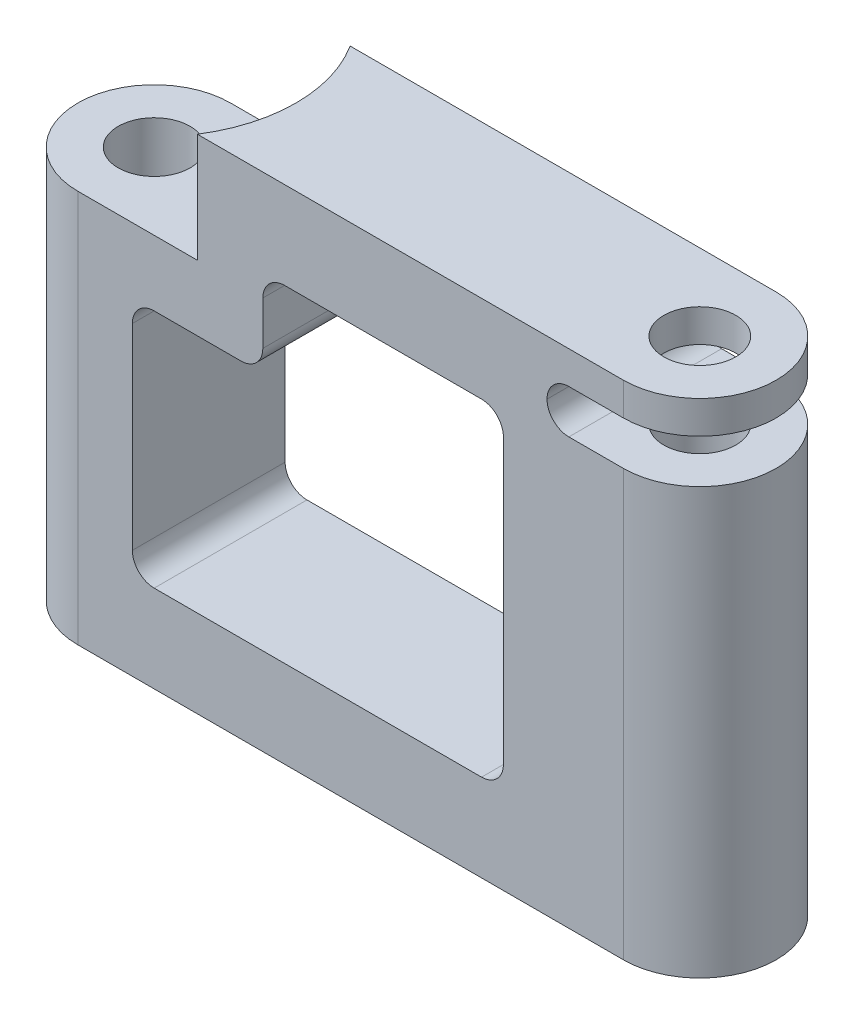
ISO-10303-21;
HEADER;
FILE_DESCRIPTION(('STEP AP214'),'2;1');
FILE_NAME('part.step','',(''),(''),'','','');
FILE_SCHEMA(('AUTOMOTIVE_DESIGN { 1 0 10303 214 1 1 1 1 }'));
ENDSEC;
DATA;
#1=APPLICATION_CONTEXT('core data for automotive mechanical design processes');
#2=APPLICATION_PROTOCOL_DEFINITION('international standard','automotive_design',2000,#1);
#3=PRODUCT_CONTEXT('',#1,'mechanical');
#4=PRODUCT('Part','Part','',(#3));
#5=PRODUCT_RELATED_PRODUCT_CATEGORY('part','',(#4));
#6=PRODUCT_DEFINITION_FORMATION('','',#4);
#7=PRODUCT_DEFINITION_CONTEXT('part definition',#1,'design');
#8=PRODUCT_DEFINITION('design','',#6,#7);
#9=PRODUCT_DEFINITION_SHAPE('','',#8);
#10=(LENGTH_UNIT() NAMED_UNIT(*) SI_UNIT(.MILLI.,.METRE.));
#11=(NAMED_UNIT(*) PLANE_ANGLE_UNIT() SI_UNIT($,.RADIAN.));
#12=(NAMED_UNIT(*) SI_UNIT($,.STERADIAN.) SOLID_ANGLE_UNIT());
#13=UNCERTAINTY_MEASURE_WITH_UNIT(LENGTH_MEASURE(1.E-05),#10,'distance_accuracy_value','');
#14=(GEOMETRIC_REPRESENTATION_CONTEXT(3) GLOBAL_UNCERTAINTY_ASSIGNED_CONTEXT((#13)) GLOBAL_UNIT_ASSIGNED_CONTEXT((#10,
#11,#12)) REPRESENTATION_CONTEXT('',''));
#15=CARTESIAN_POINT('',(0.,0.,0.));
#16=DIRECTION('',(0.,0.,1.));
#17=DIRECTION('',(1.,0.,0.));
#18=AXIS2_PLACEMENT_3D('',#15,#16,#17);
#19=CARTESIAN_POINT('',(12.5,11.5,0.));
#20=DIRECTION('',(0.,-1.,0.));
#21=DIRECTION('',(0.,0.,-1.));
#22=AXIS2_PLACEMENT_3D('',#19,#20,#21);
#23=CYLINDRICAL_SURFACE('',#22,3.5);
#24=CARTESIAN_POINT('',(12.5,10.,0.));
#25=DIRECTION('',(0.,1.,0.));
#26=DIRECTION('',(0.,0.,1.));
#27=AXIS2_PLACEMENT_3D('',#24,#25,#26);
#28=CIRCLE('',#27,3.5);
#29=CARTESIAN_POINT('',(12.5,10.,3.5));
#30=VERTEX_POINT('',#29);
#31=CARTESIAN_POINT('',(12.5,10.,-3.50000000000001));
#32=VERTEX_POINT('',#31);
#33=EDGE_CURVE('E364',#30,#32,#28,.T.);
#34=ORIENTED_EDGE('',*,*,#33,.T.);
#35=DIRECTION('',(0.,-1.,0.));
#36=VECTOR('',#35,1.);
#37=CARTESIAN_POINT('',(12.5,11.5,-3.50000000000001));
#38=LINE('',#37,#36);
#39=CARTESIAN_POINT('',(12.5,11.5,-3.50000000000001));
#40=VERTEX_POINT('',#39);
#41=EDGE_CURVE('E216',#40,#32,#38,.T.);
#42=ORIENTED_EDGE('',*,*,#41,.F.);
#43=CARTESIAN_POINT('',(12.5,11.5,0.));
#44=DIRECTION('',(0.,1.,0.));
#45=DIRECTION('',(0.,0.,1.));
#46=AXIS2_PLACEMENT_3D('',#43,#44,#45);
#47=CIRCLE('',#46,3.5);
#48=CARTESIAN_POINT('',(12.5,11.5,3.5));
#49=VERTEX_POINT('',#48);
#50=EDGE_CURVE('E385',#49,#40,#47,.T.);
#51=ORIENTED_EDGE('',*,*,#50,.F.);
#52=DIRECTION('',(0.,-1.,0.));
#53=VECTOR('',#52,1.);
#54=CARTESIAN_POINT('',(12.5,11.5,3.5));
#55=LINE('',#54,#53);
#56=EDGE_CURVE('E215',#49,#30,#55,.T.);
#57=ORIENTED_EDGE('',*,*,#56,.T.);
#58=EDGE_LOOP('',(#34,#42,#51,#57));
#59=FACE_BOUND('',#58,.T.);
#60=ADVANCED_FACE('F35',(#59),#23,.T.);
#61=CARTESIAN_POINT('',(12.5,-35.,0.));
#62=DIRECTION('',(0.,1.,0.));
#63=DIRECTION('',(0.,0.,1.));
#64=AXIS2_PLACEMENT_3D('',#61,#62,#63);
#65=CYLINDRICAL_SURFACE('',#64,1.65);
#66=CARTESIAN_POINT('',(12.5,9.99999999999999,0.));
#67=DIRECTION('',(0.,1.,0.));
#68=DIRECTION('',(0.,0.,1.));
#69=AXIS2_PLACEMENT_3D('',#66,#67,#68);
#70=CIRCLE('',#69,1.65);
#71=CARTESIAN_POINT('',(12.5,9.99999999999999,1.65));
#72=VERTEX_POINT('',#71);
#73=EDGE_CURVE('E201',#72,#72,#70,.F.);
#74=ORIENTED_EDGE('',*,*,#73,.T.);
#75=EDGE_LOOP('',(#74));
#76=FACE_BOUND('',#75,.T.);
#77=CARTESIAN_POINT('',(12.5,11.5,0.));
#78=DIRECTION('',(0.,1.,0.));
#79=DIRECTION('',(0.,0.,1.));
#80=AXIS2_PLACEMENT_3D('',#77,#78,#79);
#81=CIRCLE('',#80,1.65);
#82=CARTESIAN_POINT('',(12.5,11.5,1.65));
#83=VERTEX_POINT('',#82);
#84=EDGE_CURVE('E233',#83,#83,#81,.T.);
#85=ORIENTED_EDGE('',*,*,#84,.T.);
#86=EDGE_LOOP('',(#85));
#87=FACE_BOUND('',#86,.T.);
#88=ADVANCED_FACE('F452',(#76,#87),#65,.F.);
#89=CARTESIAN_POINT('',(-12.5,11.5,0.));
#90=DIRECTION('',(0.,-1.,0.));
#91=DIRECTION('',(0.,0.,-1.));
#92=AXIS2_PLACEMENT_3D('',#89,#90,#91);
#93=CYLINDRICAL_SURFACE('',#92,3.5);
#94=CARTESIAN_POINT('',(-12.5,6.5,0.));
#95=DIRECTION('',(0.,1.,0.));
#96=DIRECTION('',(0.,0.,1.));
#97=AXIS2_PLACEMENT_3D('',#94,#95,#96);
#98=CIRCLE('',#97,3.5);
#99=CARTESIAN_POINT('',(-12.5,6.5,-3.5));
#100=VERTEX_POINT('',#99);
#101=CARTESIAN_POINT('',(-12.5,6.5,3.5));
#102=VERTEX_POINT('',#101);
#103=EDGE_CURVE('E371',#100,#102,#98,.T.);
#104=ORIENTED_EDGE('',*,*,#103,.F.);
#105=DIRECTION('',(0.,-1.,0.));
#106=VECTOR('',#105,1.);
#107=CARTESIAN_POINT('',(-12.5,11.5,-3.5));
#108=LINE('',#107,#106);
#109=CARTESIAN_POINT('',(-12.5,-11.5,-3.5));
#110=VERTEX_POINT('',#109);
#111=EDGE_CURVE('E391',#100,#110,#108,.T.);
#112=ORIENTED_EDGE('',*,*,#111,.T.);
#113=CARTESIAN_POINT('',(-12.5,-11.5,0.));
#114=DIRECTION('',(0.,1.,0.));
#115=DIRECTION('',(0.,0.,1.));
#116=AXIS2_PLACEMENT_3D('',#113,#114,#115);
#117=CIRCLE('',#116,3.5);
#118=CARTESIAN_POINT('',(-12.5,-11.5,3.5));
#119=VERTEX_POINT('',#118);
#120=EDGE_CURVE('E382',#110,#119,#117,.T.);
#121=ORIENTED_EDGE('',*,*,#120,.T.);
#122=DIRECTION('',(0.,-1.,0.));
#123=VECTOR('',#122,1.);
#124=CARTESIAN_POINT('',(-12.5,11.5,3.5));
#125=LINE('',#124,#123);
#126=EDGE_CURVE('E219',#102,#119,#125,.T.);
#127=ORIENTED_EDGE('',*,*,#126,.F.);
#128=EDGE_LOOP('',(#104,#112,#121,#127));
#129=FACE_BOUND('',#128,.T.);
#130=ADVANCED_FACE('F406',(#129),#93,.T.);
#131=CARTESIAN_POINT('',(-12.5,-35.,0.));
#132=DIRECTION('',(0.,1.,0.));
#133=DIRECTION('',(0.,0.,1.));
#134=AXIS2_PLACEMENT_3D('',#131,#132,#133);
#135=CYLINDRICAL_SURFACE('',#134,1.65);
#136=CARTESIAN_POINT('',(-12.5,-11.5,0.));
#137=DIRECTION('',(0.,1.,0.));
#138=DIRECTION('',(0.,0.,1.));
#139=AXIS2_PLACEMENT_3D('',#136,#137,#138);
#140=CIRCLE('',#139,1.65);
#141=CARTESIAN_POINT('',(-12.5,-11.5,1.65));
#142=VERTEX_POINT('',#141);
#143=EDGE_CURVE('E226',#142,#142,#140,.T.);
#144=ORIENTED_EDGE('',*,*,#143,.F.);
#145=EDGE_LOOP('',(#144));
#146=FACE_BOUND('',#145,.T.);
#147=CARTESIAN_POINT('',(-12.5,6.5,0.));
#148=DIRECTION('',(0.,1.,0.));
#149=DIRECTION('',(0.,0.,1.));
#150=AXIS2_PLACEMENT_3D('',#147,#148,#149);
#151=CIRCLE('',#150,1.65);
#152=CARTESIAN_POINT('',(-12.5,6.5,1.65));
#153=VERTEX_POINT('',#152);
#154=EDGE_CURVE('E234',#153,#153,#151,.F.);
#155=ORIENTED_EDGE('',*,*,#154,.F.);
#156=EDGE_LOOP('',(#155));
#157=FACE_BOUND('',#156,.T.);
#158=ADVANCED_FACE('F467',(#146,#157),#135,.F.);
#159=CARTESIAN_POINT('',(-12.5,11.5,3.5));
#160=DIRECTION('',(0.,0.,-1.));
#161=DIRECTION('',(-1.,0.,0.));
#162=AXIS2_PLACEMENT_3D('',#159,#160,#161);
#163=PLANE('',#162);
#164=DIRECTION('',(1.,0.,0.));
#165=VECTOR('',#164,1.);
#166=CARTESIAN_POINT('',(-12.5,3.5,3.5));
#167=LINE('',#166,#165);
#168=CARTESIAN_POINT('',(-9.,3.5,3.5));
#169=VERTEX_POINT('',#168);
#170=CARTESIAN_POINT('',(-5.02277442494834,3.5,3.5));
#171=VERTEX_POINT('',#170);
#172=EDGE_CURVE('E261',#169,#171,#167,.T.);
#173=ORIENTED_EDGE('',*,*,#172,.T.);
#174=CARTESIAN_POINT('',(-5.02277442494834,4.5,3.5));
#175=DIRECTION('',(0.,0.,-1.));
#176=DIRECTION('',(-1.,0.,0.));
#177=AXIS2_PLACEMENT_3D('',#174,#175,#176);
#178=CIRCLE('',#177,1.);
#179=CARTESIAN_POINT('',(-4.02277442494834,4.5,3.5));
#180=VERTEX_POINT('',#179);
#181=EDGE_CURVE('E50',#171,#180,#178,.F.);
#182=ORIENTED_EDGE('',*,*,#181,.T.);
#183=DIRECTION('',(0.,1.,0.));
#184=VECTOR('',#183,1.);
#185=CARTESIAN_POINT('',(-4.02277442494834,11.5,3.5));
#186=LINE('',#185,#184);
#187=CARTESIAN_POINT('',(-4.02277442494834,6.5,3.5));
#188=VERTEX_POINT('',#187);
#189=EDGE_CURVE('E357',#180,#188,#186,.T.);
#190=ORIENTED_EDGE('',*,*,#189,.T.);
#191=CARTESIAN_POINT('',(-3.02277442494834,6.5,3.5));
#192=DIRECTION('',(0.,0.,-1.));
#193=DIRECTION('',(-1.,0.,0.));
#194=AXIS2_PLACEMENT_3D('',#191,#192,#193);
#195=CIRCLE('',#194,1.);
#196=CARTESIAN_POINT('',(-3.02277442494834,7.5,3.5));
#197=VERTEX_POINT('',#196);
#198=EDGE_CURVE('E311',#188,#197,#195,.T.);
#199=ORIENTED_EDGE('',*,*,#198,.T.);
#200=DIRECTION('',(1.,0.,0.));
#201=VECTOR('',#200,1.);
#202=CARTESIAN_POINT('',(-12.5,7.5,3.5));
#203=LINE('',#202,#201);
#204=CARTESIAN_POINT('',(6.00000000000001,7.5,3.5));
#205=VERTEX_POINT('',#204);
#206=EDGE_CURVE('E354',#197,#205,#203,.T.);
#207=ORIENTED_EDGE('',*,*,#206,.T.);
#208=CARTESIAN_POINT('',(6.00000000000001,6.5,3.5));
#209=DIRECTION('',(0.,0.,-1.));
#210=DIRECTION('',(-1.,0.,0.));
#211=AXIS2_PLACEMENT_3D('',#208,#209,#210);
#212=CIRCLE('',#211,1.);
#213=CARTESIAN_POINT('',(7.,6.5,3.5));
#214=VERTEX_POINT('',#213);
#215=EDGE_CURVE('E315',#205,#214,#212,.T.);
#216=ORIENTED_EDGE('',*,*,#215,.T.);
#217=DIRECTION('',(0.,-1.,0.));
#218=VECTOR('',#217,1.);
#219=CARTESIAN_POINT('',(7.,11.5,3.5));
#220=LINE('',#219,#218);
#221=CARTESIAN_POINT('',(7.,-6.5,3.5));
#222=VERTEX_POINT('',#221);
#223=EDGE_CURVE('E349',#214,#222,#220,.T.);
#224=ORIENTED_EDGE('',*,*,#223,.T.);
#225=CARTESIAN_POINT('',(6.00000000000001,-6.5,3.5));
#226=DIRECTION('',(0.,0.,-1.));
#227=DIRECTION('',(-1.,0.,0.));
#228=AXIS2_PLACEMENT_3D('',#225,#226,#227);
#229=CIRCLE('',#228,1.);
#230=CARTESIAN_POINT('',(6.00000000000001,-7.5,3.5));
#231=VERTEX_POINT('',#230);
#232=EDGE_CURVE('E319',#222,#231,#229,.T.);
#233=ORIENTED_EDGE('',*,*,#232,.T.);
#234=DIRECTION('',(-1.,0.,0.));
#235=VECTOR('',#234,1.);
#236=CARTESIAN_POINT('',(-12.5,-7.5,3.5));
#237=LINE('',#236,#235);
#238=CARTESIAN_POINT('',(-9.,-7.5,3.5));
#239=VERTEX_POINT('',#238);
#240=EDGE_CURVE('E344',#231,#239,#237,.T.);
#241=ORIENTED_EDGE('',*,*,#240,.T.);
#242=CARTESIAN_POINT('',(-9.,-6.5,3.5));
#243=DIRECTION('',(0.,0.,-1.));
#244=DIRECTION('',(-1.,0.,0.));
#245=AXIS2_PLACEMENT_3D('',#242,#243,#244);
#246=CIRCLE('',#245,1.);
#247=CARTESIAN_POINT('',(-10.,-6.5,3.5));
#248=VERTEX_POINT('',#247);
#249=EDGE_CURVE('E323',#239,#248,#246,.T.);
#250=ORIENTED_EDGE('',*,*,#249,.T.);
#251=DIRECTION('',(0.,1.,0.));
#252=VECTOR('',#251,1.);
#253=CARTESIAN_POINT('',(-10.,11.5,3.5));
#254=LINE('',#253,#252);
#255=CARTESIAN_POINT('',(-10.,2.5,3.5));
#256=VERTEX_POINT('',#255);
#257=EDGE_CURVE('E343',#248,#256,#254,.T.);
#258=ORIENTED_EDGE('',*,*,#257,.T.);
#259=CARTESIAN_POINT('',(-9.,2.5,3.5));
#260=DIRECTION('',(0.,0.,-1.));
#261=DIRECTION('',(-1.,0.,0.));
#262=AXIS2_PLACEMENT_3D('',#259,#260,#261);
#263=CIRCLE('',#262,1.);
#264=EDGE_CURVE('E43',#256,#169,#263,.T.);
#265=ORIENTED_EDGE('',*,*,#264,.T.);
#266=EDGE_LOOP('',(#173,#182,#190,#199,#207,#216,#224,#233,#241,#250,#258,#265));
#267=FACE_BOUND('',#266,.T.);
#268=CARTESIAN_POINT('',(10.,9.,3.5));
#269=DIRECTION('',(0.,0.,-1.));
#270=DIRECTION('',(-1.,0.,0.));
#271=AXIS2_PLACEMENT_3D('',#268,#269,#270);
#272=CIRCLE('',#271,1.);
#273=CARTESIAN_POINT('',(10.,8.,3.5));
#274=VERTEX_POINT('',#273);
#275=CARTESIAN_POINT('',(9.00000000000001,9.,3.5));
#276=VERTEX_POINT('',#275);
#277=EDGE_CURVE('E250',#274,#276,#272,.T.);
#278=ORIENTED_EDGE('',*,*,#277,.T.);
#279=CARTESIAN_POINT('',(10.,9.,3.5));
#280=DIRECTION('',(0.,0.,-1.));
#281=DIRECTION('',(-1.,0.,0.));
#282=AXIS2_PLACEMENT_3D('',#279,#280,#281);
#283=CIRCLE('',#282,1.);
#284=CARTESIAN_POINT('',(10.,10.,3.5));
#285=VERTEX_POINT('',#284);
#286=EDGE_CURVE('E254',#276,#285,#283,.T.);
#287=ORIENTED_EDGE('',*,*,#286,.T.);
#288=DIRECTION('',(1.,0.,0.));
#289=VECTOR('',#288,1.);
#290=CARTESIAN_POINT('',(-12.5,10.,3.5));
#291=LINE('',#290,#289);
#292=EDGE_CURVE('E366',#285,#30,#291,.T.);
#293=ORIENTED_EDGE('',*,*,#292,.T.);
#294=ORIENTED_EDGE('',*,*,#56,.F.);
#295=DIRECTION('',(1.,0.,0.));
#296=VECTOR('',#295,1.);
#297=CARTESIAN_POINT('',(-12.5,11.5,3.5));
#298=LINE('',#297,#296);
#299=CARTESIAN_POINT('',(-7.02277442494834,11.5,3.5));
#300=VERTEX_POINT('',#299);
#301=EDGE_CURVE('E383',#300,#49,#298,.T.);
#302=ORIENTED_EDGE('',*,*,#301,.F.);
#303=DIRECTION('',(0.,1.,0.));
#304=VECTOR('',#303,1.);
#305=CARTESIAN_POINT('',(-7.02277442494834,6.5,3.5));
#306=LINE('',#305,#304);
#307=CARTESIAN_POINT('',(-7.02277442494834,6.5,3.5));
#308=VERTEX_POINT('',#307);
#309=EDGE_CURVE('E230',#300,#308,#306,.F.);
#310=ORIENTED_EDGE('',*,*,#309,.T.);
#311=DIRECTION('',(1.,0.,0.));
#312=VECTOR('',#311,1.);
#313=CARTESIAN_POINT('',(-12.5,6.5,3.5));
#314=LINE('',#313,#312);
#315=EDGE_CURVE('E373',#102,#308,#314,.T.);
#316=ORIENTED_EDGE('',*,*,#315,.F.);
#317=ORIENTED_EDGE('',*,*,#126,.T.);
#318=DIRECTION('',(1.,0.,0.));
#319=VECTOR('',#318,1.);
#320=CARTESIAN_POINT('',(-12.5,-11.5,3.5));
#321=LINE('',#320,#319);
#322=CARTESIAN_POINT('',(12.5,-11.5,3.5));
#323=VERTEX_POINT('',#322);
#324=EDGE_CURVE('E213',#119,#323,#321,.T.);
#325=ORIENTED_EDGE('',*,*,#324,.T.);
#326=CARTESIAN_POINT('',(12.5,8.,3.5));
#327=VERTEX_POINT('',#326);
#328=EDGE_CURVE('E206',#327,#323,#55,.T.);
#329=ORIENTED_EDGE('',*,*,#328,.F.);
#330=DIRECTION('',(-1.,0.,0.));
#331=VECTOR('',#330,1.);
#332=CARTESIAN_POINT('',(-12.5,8.,3.5));
#333=LINE('',#332,#331);
#334=EDGE_CURVE('E191',#327,#274,#333,.T.);
#335=ORIENTED_EDGE('',*,*,#334,.T.);
#336=EDGE_LOOP('',(#278,#287,#293,#294,#302,#310,#316,#317,#325,#329,#335));
#337=FACE_BOUND('',#336,.T.);
#338=ADVANCED_FACE('F211',(#267,#337),#163,.F.);
#339=CARTESIAN_POINT('',(12.5,8.,-3.50000000000001));
#340=VERTEX_POINT('',#339);
#341=CARTESIAN_POINT('',(12.5,-11.5,-3.50000000000001));
#342=VERTEX_POINT('',#341);
#343=EDGE_CURVE('E208',#340,#342,#38,.T.);
#344=ORIENTED_EDGE('',*,*,#343,.F.);
#345=CARTESIAN_POINT('',(12.5,8.,0.));
#346=DIRECTION('',(0.,-1.,0.));
#347=DIRECTION('',(0.,0.,-1.));
#348=AXIS2_PLACEMENT_3D('',#345,#346,#347);
#349=CIRCLE('',#348,3.5);
#350=EDGE_CURVE('E195',#340,#327,#349,.T.);
#351=ORIENTED_EDGE('',*,*,#350,.T.);
#352=ORIENTED_EDGE('',*,*,#328,.T.);
#353=CARTESIAN_POINT('',(12.5,-11.5,0.));
#354=DIRECTION('',(0.,1.,0.));
#355=DIRECTION('',(0.,0.,1.));
#356=AXIS2_PLACEMENT_3D('',#353,#354,#355);
#357=CIRCLE('',#356,3.5);
#358=EDGE_CURVE('E395',#323,#342,#357,.T.);
#359=ORIENTED_EDGE('',*,*,#358,.T.);
#360=EDGE_LOOP('',(#344,#351,#352,#359));
#361=FACE_BOUND('',#360,.T.);
#362=ADVANCED_FACE('F204',(#361),#23,.T.);
#363=CARTESIAN_POINT('',(-12.5,11.5,-3.5));
#364=DIRECTION('',(0.,0.,1.));
#365=DIRECTION('',(1.,0.,0.));
#366=AXIS2_PLACEMENT_3D('',#363,#364,#365);
#367=PLANE('',#366);
#368=DIRECTION('',(0.,-1.,0.));
#369=VECTOR('',#368,1.);
#370=CARTESIAN_POINT('',(-4.02277442494834,11.5,-3.50000000000001));
#371=LINE('',#370,#369);
#372=CARTESIAN_POINT('',(-4.02277442494834,6.5,-3.50000000000001));
#373=VERTEX_POINT('',#372);
#374=CARTESIAN_POINT('',(-4.02277442494834,4.5,-3.50000000000001));
#375=VERTEX_POINT('',#374);
#376=EDGE_CURVE('E273',#373,#375,#371,.T.);
#377=ORIENTED_EDGE('',*,*,#376,.T.);
#378=CARTESIAN_POINT('',(-5.02277442494834,4.5,-3.5));
#379=DIRECTION('',(0.,0.,1.));
#380=DIRECTION('',(1.,0.,0.));
#381=AXIS2_PLACEMENT_3D('',#378,#379,#380);
#382=CIRCLE('',#381,1.);
#383=CARTESIAN_POINT('',(-5.02277442494834,3.5,-3.50000000000001));
#384=VERTEX_POINT('',#383);
#385=EDGE_CURVE('E309',#375,#384,#382,.F.);
#386=ORIENTED_EDGE('',*,*,#385,.T.);
#387=DIRECTION('',(-1.,0.,0.));
#388=VECTOR('',#387,1.);
#389=CARTESIAN_POINT('',(-12.5,3.5,-3.5));
#390=LINE('',#389,#388);
#391=CARTESIAN_POINT('',(-9.,3.5,-3.5));
#392=VERTEX_POINT('',#391);
#393=EDGE_CURVE('E276',#384,#392,#390,.T.);
#394=ORIENTED_EDGE('',*,*,#393,.T.);
#395=CARTESIAN_POINT('',(-9.,2.5,-3.5));
#396=DIRECTION('',(0.,0.,1.));
#397=DIRECTION('',(1.,0.,0.));
#398=AXIS2_PLACEMENT_3D('',#395,#396,#397);
#399=CIRCLE('',#398,1.);
#400=CARTESIAN_POINT('',(-10.,2.5,-3.5));
#401=VERTEX_POINT('',#400);
#402=EDGE_CURVE('E11',#392,#401,#399,.T.);
#403=ORIENTED_EDGE('',*,*,#402,.T.);
#404=DIRECTION('',(0.,-1.,0.));
#405=VECTOR('',#404,1.);
#406=CARTESIAN_POINT('',(-10.,11.5,-3.5));
#407=LINE('',#406,#405);
#408=CARTESIAN_POINT('',(-10.,-6.5,-3.5));
#409=VERTEX_POINT('',#408);
#410=EDGE_CURVE('E258',#401,#409,#407,.T.);
#411=ORIENTED_EDGE('',*,*,#410,.T.);
#412=CARTESIAN_POINT('',(-9.,-6.5,-3.5));
#413=DIRECTION('',(0.,0.,1.));
#414=DIRECTION('',(1.,0.,0.));
#415=AXIS2_PLACEMENT_3D('',#412,#413,#414);
#416=CIRCLE('',#415,1.);
#417=CARTESIAN_POINT('',(-9.,-7.5,-3.5));
#418=VERTEX_POINT('',#417);
#419=EDGE_CURVE('E325',#409,#418,#416,.T.);
#420=ORIENTED_EDGE('',*,*,#419,.T.);
#421=DIRECTION('',(1.,0.,0.));
#422=VECTOR('',#421,1.);
#423=CARTESIAN_POINT('',(-12.5,-7.5,-3.5));
#424=LINE('',#423,#422);
#425=CARTESIAN_POINT('',(6.00000000000001,-7.5,-3.50000000000001));
#426=VERTEX_POINT('',#425);
#427=EDGE_CURVE('E264',#418,#426,#424,.T.);
#428=ORIENTED_EDGE('',*,*,#427,.T.);
#429=CARTESIAN_POINT('',(6.00000000000001,-6.5,-3.50000000000001));
#430=DIRECTION('',(0.,0.,1.));
#431=DIRECTION('',(1.,0.,0.));
#432=AXIS2_PLACEMENT_3D('',#429,#430,#431);
#433=CIRCLE('',#432,1.);
#434=CARTESIAN_POINT('',(7.,-6.5,-3.50000000000001));
#435=VERTEX_POINT('',#434);
#436=EDGE_CURVE('E321',#426,#435,#433,.T.);
#437=ORIENTED_EDGE('',*,*,#436,.T.);
#438=DIRECTION('',(0.,1.,0.));
#439=VECTOR('',#438,1.);
#440=CARTESIAN_POINT('',(7.,11.5,-3.50000000000001));
#441=LINE('',#440,#439);
#442=CARTESIAN_POINT('',(7.,6.5,-3.50000000000001));
#443=VERTEX_POINT('',#442);
#444=EDGE_CURVE('E267',#435,#443,#441,.T.);
#445=ORIENTED_EDGE('',*,*,#444,.T.);
#446=CARTESIAN_POINT('',(6.00000000000001,6.5,-3.50000000000001));
#447=DIRECTION('',(0.,0.,1.));
#448=DIRECTION('',(1.,0.,0.));
#449=AXIS2_PLACEMENT_3D('',#446,#447,#448);
#450=CIRCLE('',#449,1.);
#451=CARTESIAN_POINT('',(6.00000000000001,7.5,-3.50000000000001));
#452=VERTEX_POINT('',#451);
#453=EDGE_CURVE('E317',#443,#452,#450,.T.);
#454=ORIENTED_EDGE('',*,*,#453,.T.);
#455=DIRECTION('',(-1.,0.,0.));
#456=VECTOR('',#455,1.);
#457=CARTESIAN_POINT('',(-12.5,7.5,-3.5));
#458=LINE('',#457,#456);
#459=CARTESIAN_POINT('',(-3.02277442494834,7.5,-3.50000000000001));
#460=VERTEX_POINT('',#459);
#461=EDGE_CURVE('E270',#452,#460,#458,.T.);
#462=ORIENTED_EDGE('',*,*,#461,.T.);
#463=CARTESIAN_POINT('',(-3.02277442494834,6.5,-3.50000000000001));
#464=DIRECTION('',(0.,0.,1.));
#465=DIRECTION('',(1.,0.,0.));
#466=AXIS2_PLACEMENT_3D('',#463,#464,#465);
#467=CIRCLE('',#466,1.);
#468=EDGE_CURVE('E313',#460,#373,#467,.T.);
#469=ORIENTED_EDGE('',*,*,#468,.T.);
#470=EDGE_LOOP('',(#377,#386,#394,#403,#411,#420,#428,#437,#445,#454,#462,#469));
#471=FACE_BOUND('',#470,.T.);
#472=ORIENTED_EDGE('',*,*,#41,.T.);
#473=DIRECTION('',(-1.,0.,0.));
#474=VECTOR('',#473,1.);
#475=CARTESIAN_POINT('',(-12.5,10.,-3.5));
#476=LINE('',#475,#474);
#477=CARTESIAN_POINT('',(10.,10.,-3.50000000000001));
#478=VERTEX_POINT('',#477);
#479=EDGE_CURVE('E246',#32,#478,#476,.T.);
#480=ORIENTED_EDGE('',*,*,#479,.T.);
#481=CARTESIAN_POINT('',(10.,9.,-3.50000000000001));
#482=DIRECTION('',(0.,0.,1.));
#483=DIRECTION('',(1.,0.,0.));
#484=AXIS2_PLACEMENT_3D('',#481,#482,#483);
#485=CIRCLE('',#484,1.);
#486=CARTESIAN_POINT('',(9.00000000000001,9.,-3.50000000000001));
#487=VERTEX_POINT('',#486);
#488=EDGE_CURVE('E256',#478,#487,#485,.T.);
#489=ORIENTED_EDGE('',*,*,#488,.T.);
#490=CARTESIAN_POINT('',(10.,9.,-3.50000000000001));
#491=DIRECTION('',(0.,0.,1.));
#492=DIRECTION('',(1.,0.,0.));
#493=AXIS2_PLACEMENT_3D('',#490,#491,#492);
#494=CIRCLE('',#493,1.);
#495=CARTESIAN_POINT('',(10.,8.,-3.50000000000001));
#496=VERTEX_POINT('',#495);
#497=EDGE_CURVE('E252',#487,#496,#494,.T.);
#498=ORIENTED_EDGE('',*,*,#497,.T.);
#499=DIRECTION('',(1.,0.,0.));
#500=VECTOR('',#499,1.);
#501=CARTESIAN_POINT('',(-12.5,8.,-3.5));
#502=LINE('',#501,#500);
#503=EDGE_CURVE('E209',#496,#340,#502,.T.);
#504=ORIENTED_EDGE('',*,*,#503,.T.);
#505=ORIENTED_EDGE('',*,*,#343,.T.);
#506=DIRECTION('',(-1.,0.,0.));
#507=VECTOR('',#506,1.);
#508=CARTESIAN_POINT('',(-12.5,-11.5,-3.5));
#509=LINE('',#508,#507);
#510=EDGE_CURVE('E386',#342,#110,#509,.T.);
#511=ORIENTED_EDGE('',*,*,#510,.T.);
#512=ORIENTED_EDGE('',*,*,#111,.F.);
#513=DIRECTION('',(-1.,0.,0.));
#514=VECTOR('',#513,1.);
#515=CARTESIAN_POINT('',(-12.5,6.5,-3.5));
#516=LINE('',#515,#514);
#517=CARTESIAN_POINT('',(-7.02277442494834,6.5,-3.5));
#518=VERTEX_POINT('',#517);
#519=EDGE_CURVE('E237',#518,#100,#516,.T.);
#520=ORIENTED_EDGE('',*,*,#519,.F.);
#521=DIRECTION('',(0.,1.,0.));
#522=VECTOR('',#521,1.);
#523=CARTESIAN_POINT('',(-7.02277442494834,6.5,-3.5));
#524=LINE('',#523,#522);
#525=CARTESIAN_POINT('',(-7.02277442494834,11.5,-3.5));
#526=VERTEX_POINT('',#525);
#527=EDGE_CURVE('E375',#518,#526,#524,.T.);
#528=ORIENTED_EDGE('',*,*,#527,.T.);
#529=DIRECTION('',(-1.,0.,0.));
#530=VECTOR('',#529,1.);
#531=CARTESIAN_POINT('',(-12.5,11.5,-3.5));
#532=LINE('',#531,#530);
#533=EDGE_CURVE('E388',#40,#526,#532,.T.);
#534=ORIENTED_EDGE('',*,*,#533,.F.);
#535=EDGE_LOOP('',(#472,#480,#489,#498,#504,#505,#511,#512,#520,#528,#534));
#536=FACE_BOUND('',#535,.T.);
#537=ADVANCED_FACE('F329',(#471,#536),#367,.F.);
#538=CARTESIAN_POINT('',(-12.5,11.5,0.));
#539=DIRECTION('',(0.,1.,0.));
#540=DIRECTION('',(0.,0.,1.));
#541=AXIS2_PLACEMENT_3D('',#538,#539,#540);
#542=PLANE('',#541);
#543=CARTESIAN_POINT('',(-12.5,11.5,0.));
#544=DIRECTION('',(0.,1.,0.));
#545=DIRECTION('',(0.,0.,1.));
#546=AXIS2_PLACEMENT_3D('',#543,#544,#545);
#547=CIRCLE('',#546,6.5);
#548=EDGE_CURVE('E225',#300,#526,#547,.T.);
#549=ORIENTED_EDGE('',*,*,#548,.F.);
#550=ORIENTED_EDGE('',*,*,#301,.T.);
#551=ORIENTED_EDGE('',*,*,#50,.T.);
#552=ORIENTED_EDGE('',*,*,#533,.T.);
#553=EDGE_LOOP('',(#549,#550,#551,#552));
#554=FACE_BOUND('',#553,.T.);
#555=ORIENTED_EDGE('',*,*,#84,.F.);
#556=EDGE_LOOP('',(#555));
#557=FACE_BOUND('',#556,.T.);
#558=ADVANCED_FACE('F418',(#554,#557),#542,.T.);
#559=CARTESIAN_POINT('',(-12.5,-11.5,0.));
#560=DIRECTION('',(0.,1.,0.));
#561=DIRECTION('',(0.,0.,1.));
#562=AXIS2_PLACEMENT_3D('',#559,#560,#561);
#563=PLANE('',#562);
#564=CARTESIAN_POINT('',(12.5,-11.5,0.));
#565=DIRECTION('',(0.,1.,0.));
#566=DIRECTION('',(0.,0.,1.));
#567=AXIS2_PLACEMENT_3D('',#564,#565,#566);
#568=CIRCLE('',#567,1.65);
#569=CARTESIAN_POINT('',(12.5,-11.5,1.65));
#570=VERTEX_POINT('',#569);
#571=EDGE_CURVE('E229',#570,#570,#568,.T.);
#572=ORIENTED_EDGE('',*,*,#571,.T.);
#573=EDGE_LOOP('',(#572));
#574=FACE_BOUND('',#573,.T.);
#575=ORIENTED_EDGE('',*,*,#143,.T.);
#576=EDGE_LOOP('',(#575));
#577=FACE_BOUND('',#576,.T.);
#578=ORIENTED_EDGE('',*,*,#120,.F.);
#579=ORIENTED_EDGE('',*,*,#510,.F.);
#580=ORIENTED_EDGE('',*,*,#358,.F.);
#581=ORIENTED_EDGE('',*,*,#324,.F.);
#582=EDGE_LOOP('',(#578,#579,#580,#581));
#583=FACE_BOUND('',#582,.T.);
#584=ADVANCED_FACE('F404',(#574,#577,#583),#563,.F.);
#585=CARTESIAN_POINT('',(12.5,7.99999999999999,0.));
#586=DIRECTION('',(0.,-1.,0.));
#587=DIRECTION('',(0.,0.,-1.));
#588=AXIS2_PLACEMENT_3D('',#585,#586,#587);
#589=CIRCLE('',#588,1.65);
#590=CARTESIAN_POINT('',(12.5,7.99999999999999,-1.65000000000001));
#591=VERTEX_POINT('',#590);
#592=EDGE_CURVE('E240',#591,#591,#589,.F.);
#593=ORIENTED_EDGE('',*,*,#592,.T.);
#594=EDGE_LOOP('',(#593));
#595=FACE_BOUND('',#594,.T.);
#596=ORIENTED_EDGE('',*,*,#571,.F.);
#597=EDGE_LOOP('',(#596));
#598=FACE_BOUND('',#597,.T.);
#599=ADVANCED_FACE('F459',(#595,#598),#65,.F.);
#600=CARTESIAN_POINT('',(-12.5,6.5,0.));
#601=DIRECTION('',(0.,1.,0.));
#602=DIRECTION('',(0.,0.,1.));
#603=AXIS2_PLACEMENT_3D('',#600,#601,#602);
#604=CYLINDRICAL_SURFACE('',#603,6.5);
#605=ORIENTED_EDGE('',*,*,#548,.T.);
#606=ORIENTED_EDGE('',*,*,#527,.F.);
#607=CARTESIAN_POINT('',(-12.5,6.5,0.));
#608=DIRECTION('',(0.,1.,0.));
#609=DIRECTION('',(0.,0.,1.));
#610=AXIS2_PLACEMENT_3D('',#607,#608,#609);
#611=CIRCLE('',#610,6.5);
#612=EDGE_CURVE('E238',#308,#518,#611,.T.);
#613=ORIENTED_EDGE('',*,*,#612,.F.);
#614=ORIENTED_EDGE('',*,*,#309,.F.);
#615=EDGE_LOOP('',(#605,#606,#613,#614));
#616=FACE_BOUND('',#615,.T.);
#617=ADVANCED_FACE('F414',(#616),#604,.F.);
#618=CARTESIAN_POINT('',(-12.5,6.5,0.));
#619=DIRECTION('',(0.,1.,0.));
#620=DIRECTION('',(0.,0.,1.));
#621=AXIS2_PLACEMENT_3D('',#618,#619,#620);
#622=PLANE('',#621);
#623=ORIENTED_EDGE('',*,*,#154,.T.);
#624=EDGE_LOOP('',(#623));
#625=FACE_BOUND('',#624,.T.);
#626=ORIENTED_EDGE('',*,*,#315,.T.);
#627=ORIENTED_EDGE('',*,*,#612,.T.);
#628=ORIENTED_EDGE('',*,*,#519,.T.);
#629=ORIENTED_EDGE('',*,*,#103,.T.);
#630=EDGE_LOOP('',(#626,#627,#628,#629));
#631=FACE_BOUND('',#630,.T.);
#632=ADVANCED_FACE('F411',(#625,#631),#622,.T.);
#633=CARTESIAN_POINT('',(9.00000000000001,10.,-6.5));
#634=DIRECTION('',(0.,1.,0.));
#635=DIRECTION('',(0.,0.,1.));
#636=AXIS2_PLACEMENT_3D('',#633,#634,#635);
#637=PLANE('',#636);
#638=ORIENTED_EDGE('',*,*,#73,.F.);
#639=EDGE_LOOP('',(#638));
#640=FACE_BOUND('',#639,.T.);
#641=ORIENTED_EDGE('',*,*,#292,.F.);
#642=DIRECTION('',(0.,0.,1.));
#643=VECTOR('',#642,1.);
#644=CARTESIAN_POINT('',(10.,10.,-3.50000000000001));
#645=LINE('',#644,#643);
#646=EDGE_CURVE('E248',#285,#478,#645,.F.);
#647=ORIENTED_EDGE('',*,*,#646,.T.);
#648=ORIENTED_EDGE('',*,*,#479,.F.);
#649=ORIENTED_EDGE('',*,*,#33,.F.);
#650=EDGE_LOOP('',(#641,#647,#648,#649));
#651=FACE_BOUND('',#650,.T.);
#652=ADVANCED_FACE('F437',(#640,#651),#637,.F.);
#653=CARTESIAN_POINT('',(16.,8.,-6.5));
#654=DIRECTION('',(0.,-1.,0.));
#655=DIRECTION('',(0.,0.,-1.));
#656=AXIS2_PLACEMENT_3D('',#653,#654,#655);
#657=PLANE('',#656);
#658=ORIENTED_EDGE('',*,*,#592,.F.);
#659=EDGE_LOOP('',(#658));
#660=FACE_BOUND('',#659,.T.);
#661=ORIENTED_EDGE('',*,*,#503,.F.);
#662=DIRECTION('',(0.,0.,1.));
#663=VECTOR('',#662,1.);
#664=CARTESIAN_POINT('',(10.,8.,3.5));
#665=LINE('',#664,#663);
#666=EDGE_CURVE('E198',#496,#274,#665,.T.);
#667=ORIENTED_EDGE('',*,*,#666,.T.);
#668=ORIENTED_EDGE('',*,*,#334,.F.);
#669=ORIENTED_EDGE('',*,*,#350,.F.);
#670=EDGE_LOOP('',(#661,#667,#668,#669));
#671=FACE_BOUND('',#670,.T.);
#672=ADVANCED_FACE('F194',(#660,#671),#657,.F.);
#673=CARTESIAN_POINT('',(10.,9.,-6.5));
#674=DIRECTION('',(0.,0.,-1.));
#675=DIRECTION('',(-1.,0.,0.));
#676=AXIS2_PLACEMENT_3D('',#673,#674,#675);
#677=CYLINDRICAL_SURFACE('',#676,1.);
#678=DIRECTION('',(0.,0.,1.));
#679=VECTOR('',#678,1.);
#680=CARTESIAN_POINT('',(9.00000000000001,9.,3.5));
#681=LINE('',#680,#679);
#682=EDGE_CURVE('E243',#487,#276,#681,.T.);
#683=ORIENTED_EDGE('',*,*,#682,.F.);
#684=ORIENTED_EDGE('',*,*,#488,.F.);
#685=ORIENTED_EDGE('',*,*,#646,.F.);
#686=ORIENTED_EDGE('',*,*,#286,.F.);
#687=EDGE_LOOP('',(#683,#684,#685,#686));
#688=FACE_BOUND('',#687,.T.);
#689=ADVANCED_FACE('F431',(#688),#677,.F.);
#690=CARTESIAN_POINT('',(10.,9.,-6.5));
#691=DIRECTION('',(0.,0.,-1.));
#692=DIRECTION('',(-1.,0.,0.));
#693=AXIS2_PLACEMENT_3D('',#690,#691,#692);
#694=CYLINDRICAL_SURFACE('',#693,1.);
#695=ORIENTED_EDGE('',*,*,#497,.F.);
#696=ORIENTED_EDGE('',*,*,#682,.T.);
#697=ORIENTED_EDGE('',*,*,#277,.F.);
#698=ORIENTED_EDGE('',*,*,#666,.F.);
#699=EDGE_LOOP('',(#695,#696,#697,#698));
#700=FACE_BOUND('',#699,.T.);
#701=ADVANCED_FACE('F435',(#700),#694,.F.);
#702=CARTESIAN_POINT('',(-4.02277442494834,3.5,-21.5));
#703=DIRECTION('',(0.,1.,0.));
#704=DIRECTION('',(-1.,0.,0.));
#705=AXIS2_PLACEMENT_3D('',#702,#703,#704);
#706=PLANE('',#705);
#707=ORIENTED_EDGE('',*,*,#172,.F.);
#708=DIRECTION('',(0.,0.,1.));
#709=VECTOR('',#708,1.);
#710=CARTESIAN_POINT('',(-9.,3.5,-3.5));
#711=LINE('',#710,#709);
#712=EDGE_CURVE('E306',#169,#392,#711,.F.);
#713=ORIENTED_EDGE('',*,*,#712,.T.);
#714=ORIENTED_EDGE('',*,*,#393,.F.);
#715=DIRECTION('',(0.,0.,1.));
#716=VECTOR('',#715,1.);
#717=CARTESIAN_POINT('',(-5.02277442494834,3.5,-21.5));
#718=LINE('',#717,#716);
#719=EDGE_CURVE('E304',#384,#171,#718,.T.);
#720=ORIENTED_EDGE('',*,*,#719,.T.);
#721=EDGE_LOOP('',(#707,#713,#714,#720));
#722=FACE_BOUND('',#721,.T.);
#723=ADVANCED_FACE('F478',(#722),#706,.F.);
#724=CARTESIAN_POINT('',(-4.02277442494834,7.5,-21.5));
#725=DIRECTION('',(-1.,0.,0.));
#726=DIRECTION('',(0.,0.,1.));
#727=AXIS2_PLACEMENT_3D('',#724,#725,#726);
#728=PLANE('',#727);
#729=ORIENTED_EDGE('',*,*,#376,.F.);
#730=DIRECTION('',(0.,0.,1.));
#731=VECTOR('',#730,1.);
#732=CARTESIAN_POINT('',(-4.02277442494834,6.5,3.5));
#733=LINE('',#732,#731);
#734=EDGE_CURVE('E281',#373,#188,#733,.T.);
#735=ORIENTED_EDGE('',*,*,#734,.T.);
#736=ORIENTED_EDGE('',*,*,#189,.F.);
#737=DIRECTION('',(0.,0.,1.));
#738=VECTOR('',#737,1.);
#739=CARTESIAN_POINT('',(-4.02277442494834,4.5,-21.5));
#740=LINE('',#739,#738);
#741=EDGE_CURVE('E279',#180,#375,#740,.F.);
#742=ORIENTED_EDGE('',*,*,#741,.T.);
#743=EDGE_LOOP('',(#729,#735,#736,#742));
#744=FACE_BOUND('',#743,.T.);
#745=ADVANCED_FACE('F508',(#744),#728,.F.);
#746=CARTESIAN_POINT('',(7.00000000000001,7.5,-21.5));
#747=DIRECTION('',(0.,1.,0.));
#748=DIRECTION('',(-1.,0.,0.));
#749=AXIS2_PLACEMENT_3D('',#746,#747,#748);
#750=PLANE('',#749);
#751=ORIENTED_EDGE('',*,*,#206,.F.);
#752=DIRECTION('',(0.,0.,1.));
#753=VECTOR('',#752,1.);
#754=CARTESIAN_POINT('',(-3.02277442494834,7.5,-3.50000000000001));
#755=LINE('',#754,#753);
#756=EDGE_CURVE('E287',#197,#460,#755,.F.);
#757=ORIENTED_EDGE('',*,*,#756,.T.);
#758=ORIENTED_EDGE('',*,*,#461,.F.);
#759=DIRECTION('',(0.,0.,1.));
#760=VECTOR('',#759,1.);
#761=CARTESIAN_POINT('',(6.00000000000001,7.5,3.5));
#762=LINE('',#761,#760);
#763=EDGE_CURVE('E284',#452,#205,#762,.T.);
#764=ORIENTED_EDGE('',*,*,#763,.T.);
#765=EDGE_LOOP('',(#751,#757,#758,#764));
#766=FACE_BOUND('',#765,.T.);
#767=ADVANCED_FACE('F515',(#766),#750,.F.);
#768=CARTESIAN_POINT('',(7.00000000000001,-7.5,-21.5));
#769=DIRECTION('',(1.,0.,0.));
#770=DIRECTION('',(0.,1.,0.));
#771=AXIS2_PLACEMENT_3D('',#768,#769,#770);
#772=PLANE('',#771);
#773=ORIENTED_EDGE('',*,*,#223,.F.);
#774=DIRECTION('',(0.,0.,1.));
#775=VECTOR('',#774,1.);
#776=CARTESIAN_POINT('',(7.00000000000001,6.5,-3.50000000000001));
#777=LINE('',#776,#775);
#778=EDGE_CURVE('E292',#214,#443,#777,.F.);
#779=ORIENTED_EDGE('',*,*,#778,.T.);
#780=ORIENTED_EDGE('',*,*,#444,.F.);
#781=DIRECTION('',(0.,0.,1.));
#782=VECTOR('',#781,1.);
#783=CARTESIAN_POINT('',(7.00000000000001,-6.5,3.5));
#784=LINE('',#783,#782);
#785=EDGE_CURVE('E289',#435,#222,#784,.T.);
#786=ORIENTED_EDGE('',*,*,#785,.T.);
#787=EDGE_LOOP('',(#773,#779,#780,#786));
#788=FACE_BOUND('',#787,.T.);
#789=ADVANCED_FACE('F521',(#788),#772,.F.);
#790=CARTESIAN_POINT('',(-10.,-7.5,-21.5));
#791=DIRECTION('',(0.,-1.,0.));
#792=DIRECTION('',(0.,0.,-1.));
#793=AXIS2_PLACEMENT_3D('',#790,#791,#792);
#794=PLANE('',#793);
#795=ORIENTED_EDGE('',*,*,#240,.F.);
#796=DIRECTION('',(0.,0.,1.));
#797=VECTOR('',#796,1.);
#798=CARTESIAN_POINT('',(6.00000000000001,-7.5,-3.50000000000001));
#799=LINE('',#798,#797);
#800=EDGE_CURVE('E297',#231,#426,#799,.F.);
#801=ORIENTED_EDGE('',*,*,#800,.T.);
#802=ORIENTED_EDGE('',*,*,#427,.F.);
#803=DIRECTION('',(0.,0.,1.));
#804=VECTOR('',#803,1.);
#805=CARTESIAN_POINT('',(-9.,-7.5,3.5));
#806=LINE('',#805,#804);
#807=EDGE_CURVE('E294',#418,#239,#806,.T.);
#808=ORIENTED_EDGE('',*,*,#807,.T.);
#809=EDGE_LOOP('',(#795,#801,#802,#808));
#810=FACE_BOUND('',#809,.T.);
#811=ADVANCED_FACE('F338',(#810),#794,.F.);
#812=CARTESIAN_POINT('',(-10.,3.5,-21.5));
#813=DIRECTION('',(-1.,0.,0.));
#814=DIRECTION('',(0.,-1.,0.));
#815=AXIS2_PLACEMENT_3D('',#812,#813,#814);
#816=PLANE('',#815);
#817=ORIENTED_EDGE('',*,*,#257,.F.);
#818=DIRECTION('',(0.,0.,1.));
#819=VECTOR('',#818,1.);
#820=CARTESIAN_POINT('',(-10.,-6.5,-3.5));
#821=LINE('',#820,#819);
#822=EDGE_CURVE('E302',#248,#409,#821,.F.);
#823=ORIENTED_EDGE('',*,*,#822,.T.);
#824=ORIENTED_EDGE('',*,*,#410,.F.);
#825=DIRECTION('',(0.,0.,1.));
#826=VECTOR('',#825,1.);
#827=CARTESIAN_POINT('',(-10.,2.5,3.5));
#828=LINE('',#827,#826);
#829=EDGE_CURVE('E299',#401,#256,#828,.T.);
#830=ORIENTED_EDGE('',*,*,#829,.T.);
#831=EDGE_LOOP('',(#817,#823,#824,#830));
#832=FACE_BOUND('',#831,.T.);
#833=ADVANCED_FACE('F346',(#832),#816,.F.);
#834=CARTESIAN_POINT('',(-3.02277442494834,6.5,-21.5));
#835=DIRECTION('',(0.,0.,-1.));
#836=DIRECTION('',(-1.,0.,0.));
#837=AXIS2_PLACEMENT_3D('',#834,#835,#836);
#838=CYLINDRICAL_SURFACE('',#837,1.);
#839=ORIENTED_EDGE('',*,*,#468,.F.);
#840=ORIENTED_EDGE('',*,*,#756,.F.);
#841=ORIENTED_EDGE('',*,*,#198,.F.);
#842=ORIENTED_EDGE('',*,*,#734,.F.);
#843=EDGE_LOOP('',(#839,#840,#841,#842));
#844=FACE_BOUND('',#843,.T.);
#845=ADVANCED_FACE('F481',(#844),#838,.F.);
#846=CARTESIAN_POINT('',(6.00000000000001,6.5,-21.5));
#847=DIRECTION('',(0.,0.,-1.));
#848=DIRECTION('',(-1.,0.,0.));
#849=AXIS2_PLACEMENT_3D('',#846,#847,#848);
#850=CYLINDRICAL_SURFACE('',#849,1.);
#851=ORIENTED_EDGE('',*,*,#453,.F.);
#852=ORIENTED_EDGE('',*,*,#778,.F.);
#853=ORIENTED_EDGE('',*,*,#215,.F.);
#854=ORIENTED_EDGE('',*,*,#763,.F.);
#855=EDGE_LOOP('',(#851,#852,#853,#854));
#856=FACE_BOUND('',#855,.T.);
#857=ADVANCED_FACE('F484',(#856),#850,.F.);
#858=CARTESIAN_POINT('',(6.00000000000001,-6.5,-21.5));
#859=DIRECTION('',(0.,0.,-1.));
#860=DIRECTION('',(-1.,0.,0.));
#861=AXIS2_PLACEMENT_3D('',#858,#859,#860);
#862=CYLINDRICAL_SURFACE('',#861,1.);
#863=ORIENTED_EDGE('',*,*,#436,.F.);
#864=ORIENTED_EDGE('',*,*,#800,.F.);
#865=ORIENTED_EDGE('',*,*,#232,.F.);
#866=ORIENTED_EDGE('',*,*,#785,.F.);
#867=EDGE_LOOP('',(#863,#864,#865,#866));
#868=FACE_BOUND('',#867,.T.);
#869=ADVANCED_FACE('F488',(#868),#862,.F.);
#870=CARTESIAN_POINT('',(-9.,-6.5,-21.5));
#871=DIRECTION('',(0.,0.,-1.));
#872=DIRECTION('',(-1.,0.,0.));
#873=AXIS2_PLACEMENT_3D('',#870,#871,#872);
#874=CYLINDRICAL_SURFACE('',#873,1.);
#875=ORIENTED_EDGE('',*,*,#419,.F.);
#876=ORIENTED_EDGE('',*,*,#822,.F.);
#877=ORIENTED_EDGE('',*,*,#249,.F.);
#878=ORIENTED_EDGE('',*,*,#807,.F.);
#879=EDGE_LOOP('',(#875,#876,#877,#878));
#880=FACE_BOUND('',#879,.T.);
#881=ADVANCED_FACE('F341',(#880),#874,.F.);
#882=CARTESIAN_POINT('',(-9.,2.5,-21.5));
#883=DIRECTION('',(0.,0.,-1.));
#884=DIRECTION('',(-1.,0.,0.));
#885=AXIS2_PLACEMENT_3D('',#882,#883,#884);
#886=CYLINDRICAL_SURFACE('',#885,1.);
#887=ORIENTED_EDGE('',*,*,#402,.F.);
#888=ORIENTED_EDGE('',*,*,#712,.F.);
#889=ORIENTED_EDGE('',*,*,#264,.F.);
#890=ORIENTED_EDGE('',*,*,#829,.F.);
#891=EDGE_LOOP('',(#887,#888,#889,#890));
#892=FACE_BOUND('',#891,.T.);
#893=ADVANCED_FACE('F494',(#892),#886,.F.);
#894=CARTESIAN_POINT('',(-5.02277442494834,4.5,-21.5));
#895=DIRECTION('',(0.,0.,1.));
#896=DIRECTION('',(1.,0.,0.));
#897=AXIS2_PLACEMENT_3D('',#894,#895,#896);
#898=CYLINDRICAL_SURFACE('',#897,1.);
#899=ORIENTED_EDGE('',*,*,#385,.F.);
#900=ORIENTED_EDGE('',*,*,#741,.F.);
#901=ORIENTED_EDGE('',*,*,#181,.F.);
#902=ORIENTED_EDGE('',*,*,#719,.F.);
#903=EDGE_LOOP('',(#899,#900,#901,#902));
#904=FACE_BOUND('',#903,.T.);
#905=ADVANCED_FACE('F37',(#904),#898,.T.);
#906=CLOSED_SHELL('',(#60,#88,#130,#158,#338,#362,#537,#558,#584,#599,#617,#632,#652,#672,#689,
#701,#723,#745,#767,#789,#811,#833,#845,#857,#869,#881,#893,#905));
#907=MANIFOLD_SOLID_BREP('B2',#906);
#908=ADVANCED_BREP_SHAPE_REPRESENTATION('',(#18,#907),#14);
#909=SHAPE_DEFINITION_REPRESENTATION(#9,#908);
ENDSEC;
END-ISO-10303-21;
